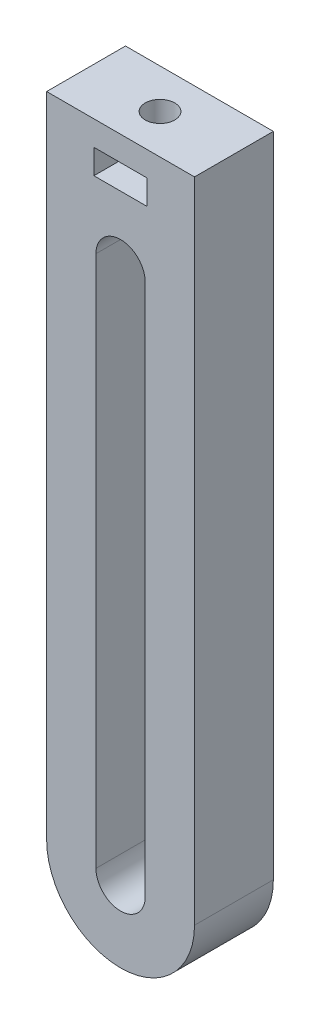
ISO-10303-21;
HEADER;
FILE_DESCRIPTION(('STEP AP214'),'2;1');
FILE_NAME('part.step','',(''),(''),'','','');
FILE_SCHEMA(('AUTOMOTIVE_DESIGN { 1 0 10303 214 1 1 1 1 }'));
ENDSEC;
DATA;
#1=APPLICATION_CONTEXT('core data for automotive mechanical design processes');
#2=APPLICATION_PROTOCOL_DEFINITION('international standard','automotive_design',2000,#1);
#3=PRODUCT_CONTEXT('',#1,'mechanical');
#4=PRODUCT('Part','Part','',(#3));
#5=PRODUCT_RELATED_PRODUCT_CATEGORY('part','',(#4));
#6=PRODUCT_DEFINITION_FORMATION('','',#4);
#7=PRODUCT_DEFINITION_CONTEXT('part definition',#1,'design');
#8=PRODUCT_DEFINITION('design','',#6,#7);
#9=PRODUCT_DEFINITION_SHAPE('','',#8);
#10=(LENGTH_UNIT() NAMED_UNIT(*) SI_UNIT(.MILLI.,.METRE.));
#11=(NAMED_UNIT(*) PLANE_ANGLE_UNIT() SI_UNIT($,.RADIAN.));
#12=(NAMED_UNIT(*) SI_UNIT($,.STERADIAN.) SOLID_ANGLE_UNIT());
#13=UNCERTAINTY_MEASURE_WITH_UNIT(LENGTH_MEASURE(1.E-05),#10,'distance_accuracy_value','');
#14=(GEOMETRIC_REPRESENTATION_CONTEXT(3) GLOBAL_UNCERTAINTY_ASSIGNED_CONTEXT((#13)) GLOBAL_UNIT_ASSIGNED_CONTEXT((#10,
#11,#12)) REPRESENTATION_CONTEXT('',''));
#15=CARTESIAN_POINT('',(0.,0.,0.));
#16=DIRECTION('',(0.,0.,1.));
#17=DIRECTION('',(1.,0.,0.));
#18=AXIS2_PLACEMENT_3D('',#15,#16,#17);
#19=CARTESIAN_POINT('',(0.,-27.,8.));
#20=DIRECTION('',(0.,0.,-1.));
#21=DIRECTION('',(-1.,0.,0.));
#22=AXIS2_PLACEMENT_3D('',#19,#20,#21);
#23=PLANE('',#22);
#24=DIRECTION('',(-1.,0.,0.));
#25=VECTOR('',#24,1.);
#26=CARTESIAN_POINT('',(-2.70500000000001,36.25,8.));
#27=LINE('',#26,#25);
#28=CARTESIAN_POINT('',(2.70499999999999,36.25,8.));
#29=VERTEX_POINT('',#28);
#30=CARTESIAN_POINT('',(-2.70500000000001,36.25,8.));
#31=VERTEX_POINT('',#30);
#32=EDGE_CURVE('E142',#29,#31,#27,.T.);
#33=ORIENTED_EDGE('',*,*,#32,.F.);
#34=DIRECTION('',(0.,1.,0.));
#35=VECTOR('',#34,1.);
#36=CARTESIAN_POINT('',(2.70499999999999,36.25,8.));
#37=LINE('',#36,#35);
#38=CARTESIAN_POINT('',(2.70499999999999,33.75,8.));
#39=VERTEX_POINT('',#38);
#40=EDGE_CURVE('E146',#39,#29,#37,.T.);
#41=ORIENTED_EDGE('',*,*,#40,.F.);
#42=DIRECTION('',(1.,0.,0.));
#43=VECTOR('',#42,1.);
#44=CARTESIAN_POINT('',(-2.70500000000001,33.75,8.));
#45=LINE('',#44,#43);
#46=CARTESIAN_POINT('',(-2.70500000000001,33.75,8.));
#47=VERTEX_POINT('',#46);
#48=EDGE_CURVE('E150',#47,#39,#45,.T.);
#49=ORIENTED_EDGE('',*,*,#48,.F.);
#50=DIRECTION('',(0.,-1.,0.));
#51=VECTOR('',#50,1.);
#52=CARTESIAN_POINT('',(-2.70500000000001,36.25,8.));
#53=LINE('',#52,#51);
#54=EDGE_CURVE('E133',#31,#47,#53,.T.);
#55=ORIENTED_EDGE('',*,*,#54,.F.);
#56=EDGE_LOOP('',(#33,#41,#49,#55));
#57=FACE_BOUND('',#56,.T.);
#58=DIRECTION('',(0.,1.,0.));
#59=VECTOR('',#58,1.);
#60=CARTESIAN_POINT('',(7.5,-27.,8.));
#61=LINE('',#60,#59);
#62=CARTESIAN_POINT('',(7.5,-27.,8.));
#63=VERTEX_POINT('',#62);
#64=CARTESIAN_POINT('',(7.5,38.75,8.));
#65=VERTEX_POINT('',#64);
#66=EDGE_CURVE('E205',#63,#65,#61,.T.);
#67=ORIENTED_EDGE('',*,*,#66,.T.);
#68=DIRECTION('',(-1.,0.,0.));
#69=VECTOR('',#68,1.);
#70=CARTESIAN_POINT('',(-7.5,38.75,8.));
#71=LINE('',#70,#69);
#72=CARTESIAN_POINT('',(-7.5,38.75,8.));
#73=VERTEX_POINT('',#72);
#74=EDGE_CURVE('E208',#65,#73,#71,.T.);
#75=ORIENTED_EDGE('',*,*,#74,.T.);
#76=DIRECTION('',(0.,-1.,0.));
#77=VECTOR('',#76,1.);
#78=CARTESIAN_POINT('',(-7.5,38.75,8.));
#79=LINE('',#78,#77);
#80=CARTESIAN_POINT('',(-7.5,-27.,8.));
#81=VERTEX_POINT('',#80);
#82=EDGE_CURVE('E211',#73,#81,#79,.T.);
#83=ORIENTED_EDGE('',*,*,#82,.T.);
#84=CARTESIAN_POINT('',(0.,-27.,8.));
#85=DIRECTION('',(0.,0.,1.));
#86=DIRECTION('',(-1.,0.,0.));
#87=AXIS2_PLACEMENT_3D('',#84,#85,#86);
#88=CIRCLE('',#87,7.5);
#89=EDGE_CURVE('E213',#81,#63,#88,.T.);
#90=ORIENTED_EDGE('',*,*,#89,.T.);
#91=EDGE_LOOP('',(#67,#75,#83,#90));
#92=FACE_BOUND('',#91,.T.);
#93=CARTESIAN_POINT('',(0.,27.,8.));
#94=DIRECTION('',(0.,0.,1.));
#95=DIRECTION('',(1.,0.,0.));
#96=AXIS2_PLACEMENT_3D('',#93,#94,#95);
#97=CIRCLE('',#96,2.49999999999999);
#98=CARTESIAN_POINT('',(2.49999999999998,27.,8.));
#99=VERTEX_POINT('',#98);
#100=CARTESIAN_POINT('',(-2.5,27.,8.));
#101=VERTEX_POINT('',#100);
#102=EDGE_CURVE('E176',#99,#101,#97,.T.);
#103=ORIENTED_EDGE('',*,*,#102,.F.);
#104=DIRECTION('',(0.,1.,0.));
#105=VECTOR('',#104,1.);
#106=CARTESIAN_POINT('',(2.49999999999998,27.,8.));
#107=LINE('',#106,#105);
#108=CARTESIAN_POINT('',(2.5,-27.,8.));
#109=VERTEX_POINT('',#108);
#110=EDGE_CURVE('E183',#109,#99,#107,.T.);
#111=ORIENTED_EDGE('',*,*,#110,.F.);
#112=CARTESIAN_POINT('',(0.,-27.,8.));
#113=DIRECTION('',(0.,0.,1.));
#114=DIRECTION('',(1.,0.,0.));
#115=AXIS2_PLACEMENT_3D('',#112,#113,#114);
#116=CIRCLE('',#115,2.49999999999999);
#117=CARTESIAN_POINT('',(-2.49999999999998,-27.,8.));
#118=VERTEX_POINT('',#117);
#119=EDGE_CURVE('E181',#118,#109,#116,.T.);
#120=ORIENTED_EDGE('',*,*,#119,.F.);
#121=DIRECTION('',(0.,-1.,0.));
#122=VECTOR('',#121,1.);
#123=CARTESIAN_POINT('',(-2.5,27.,8.));
#124=LINE('',#123,#122);
#125=EDGE_CURVE('E178',#101,#118,#124,.T.);
#126=ORIENTED_EDGE('',*,*,#125,.F.);
#127=EDGE_LOOP('',(#103,#111,#120,#126));
#128=FACE_BOUND('',#127,.T.);
#129=ADVANCED_FACE('F32',(#57,#92,#128),#23,.F.);
#130=CARTESIAN_POINT('',(0.,-27.,0.));
#131=DIRECTION('',(0.,0.,-1.));
#132=DIRECTION('',(-1.,0.,0.));
#133=AXIS2_PLACEMENT_3D('',#130,#131,#132);
#134=PLANE('',#133);
#135=DIRECTION('',(0.,1.,0.));
#136=VECTOR('',#135,1.);
#137=CARTESIAN_POINT('',(7.5,-27.,0.));
#138=LINE('',#137,#136);
#139=CARTESIAN_POINT('',(7.5,-27.,0.));
#140=VERTEX_POINT('',#139);
#141=CARTESIAN_POINT('',(7.5,38.75,0.));
#142=VERTEX_POINT('',#141);
#143=EDGE_CURVE('E204',#140,#142,#138,.T.);
#144=ORIENTED_EDGE('',*,*,#143,.F.);
#145=CARTESIAN_POINT('',(0.,-27.,0.));
#146=DIRECTION('',(0.,0.,1.));
#147=DIRECTION('',(-1.,0.,0.));
#148=AXIS2_PLACEMENT_3D('',#145,#146,#147);
#149=CIRCLE('',#148,7.5);
#150=CARTESIAN_POINT('',(-7.5,-27.,0.));
#151=VERTEX_POINT('',#150);
#152=EDGE_CURVE('E209',#151,#140,#149,.T.);
#153=ORIENTED_EDGE('',*,*,#152,.F.);
#154=DIRECTION('',(0.,-1.,0.));
#155=VECTOR('',#154,1.);
#156=CARTESIAN_POINT('',(-7.5,38.75,0.));
#157=LINE('',#156,#155);
#158=CARTESIAN_POINT('',(-7.5,38.75,0.));
#159=VERTEX_POINT('',#158);
#160=EDGE_CURVE('E220',#159,#151,#157,.T.);
#161=ORIENTED_EDGE('',*,*,#160,.F.);
#162=DIRECTION('',(-1.,0.,0.));
#163=VECTOR('',#162,1.);
#164=CARTESIAN_POINT('',(-7.5,38.75,0.));
#165=LINE('',#164,#163);
#166=EDGE_CURVE('E218',#142,#159,#165,.T.);
#167=ORIENTED_EDGE('',*,*,#166,.F.);
#168=EDGE_LOOP('',(#144,#153,#161,#167));
#169=FACE_BOUND('',#168,.T.);
#170=DIRECTION('',(0.,1.,0.));
#171=VECTOR('',#170,1.);
#172=CARTESIAN_POINT('',(2.49999999999998,27.,0.));
#173=LINE('',#172,#171);
#174=CARTESIAN_POINT('',(2.5,-27.,0.));
#175=VERTEX_POINT('',#174);
#176=CARTESIAN_POINT('',(2.49999999999998,27.,0.));
#177=VERTEX_POINT('',#176);
#178=EDGE_CURVE('E179',#175,#177,#173,.T.);
#179=ORIENTED_EDGE('',*,*,#178,.T.);
#180=CARTESIAN_POINT('',(0.,27.,0.));
#181=DIRECTION('',(0.,0.,1.));
#182=DIRECTION('',(1.,0.,0.));
#183=AXIS2_PLACEMENT_3D('',#180,#181,#182);
#184=CIRCLE('',#183,2.49999999999999);
#185=CARTESIAN_POINT('',(-2.5,27.,0.));
#186=VERTEX_POINT('',#185);
#187=EDGE_CURVE('E171',#177,#186,#184,.T.);
#188=ORIENTED_EDGE('',*,*,#187,.T.);
#189=DIRECTION('',(0.,-1.,0.));
#190=VECTOR('',#189,1.);
#191=CARTESIAN_POINT('',(-2.5,27.,0.));
#192=LINE('',#191,#190);
#193=CARTESIAN_POINT('',(-2.49999999999998,-27.,0.));
#194=VERTEX_POINT('',#193);
#195=EDGE_CURVE('E188',#186,#194,#192,.T.);
#196=ORIENTED_EDGE('',*,*,#195,.T.);
#197=CARTESIAN_POINT('',(0.,-27.,0.));
#198=DIRECTION('',(0.,0.,1.));
#199=DIRECTION('',(1.,0.,0.));
#200=AXIS2_PLACEMENT_3D('',#197,#198,#199);
#201=CIRCLE('',#200,2.49999999999999);
#202=EDGE_CURVE('E191',#194,#175,#201,.T.);
#203=ORIENTED_EDGE('',*,*,#202,.T.);
#204=EDGE_LOOP('',(#179,#188,#196,#203));
#205=FACE_BOUND('',#204,.T.);
#206=ADVANCED_FACE('F239',(#169,#205),#134,.T.);
#207=CARTESIAN_POINT('',(7.5,-27.,8.));
#208=DIRECTION('',(-1.,0.,0.));
#209=DIRECTION('',(0.,0.,1.));
#210=AXIS2_PLACEMENT_3D('',#207,#208,#209);
#211=PLANE('',#210);
#212=ORIENTED_EDGE('',*,*,#143,.T.);
#213=DIRECTION('',(0.,0.,-1.));
#214=VECTOR('',#213,1.);
#215=CARTESIAN_POINT('',(7.5,38.75,8.));
#216=LINE('',#215,#214);
#217=EDGE_CURVE('E11',#65,#142,#216,.T.);
#218=ORIENTED_EDGE('',*,*,#217,.F.);
#219=ORIENTED_EDGE('',*,*,#66,.F.);
#220=DIRECTION('',(0.,0.,-1.));
#221=VECTOR('',#220,1.);
#222=CARTESIAN_POINT('',(7.5,-27.,8.));
#223=LINE('',#222,#221);
#224=EDGE_CURVE('E215',#63,#140,#223,.T.);
#225=ORIENTED_EDGE('',*,*,#224,.T.);
#226=EDGE_LOOP('',(#212,#218,#219,#225));
#227=FACE_BOUND('',#226,.T.);
#228=ADVANCED_FACE('F34',(#227),#211,.F.);
#229=CARTESIAN_POINT('',(-7.5,38.75,8.));
#230=DIRECTION('',(0.,-1.,0.));
#231=DIRECTION('',(0.,0.,-1.));
#232=AXIS2_PLACEMENT_3D('',#229,#230,#231);
#233=PLANE('',#232);
#234=CARTESIAN_POINT('',(0.,38.75,4.));
#235=DIRECTION('',(0.,1.,0.));
#236=DIRECTION('',(0.,0.,1.));
#237=AXIS2_PLACEMENT_3D('',#234,#235,#236);
#238=CIRCLE('',#237,1.5);
#239=CARTESIAN_POINT('',(0.,38.75,5.5));
#240=VERTEX_POINT('',#239);
#241=EDGE_CURVE('E332',#240,#240,#238,.T.);
#242=ORIENTED_EDGE('',*,*,#241,.F.);
#243=EDGE_LOOP('',(#242));
#244=FACE_BOUND('',#243,.T.);
#245=ORIENTED_EDGE('',*,*,#166,.T.);
#246=DIRECTION('',(0.,0.,-1.));
#247=VECTOR('',#246,1.);
#248=CARTESIAN_POINT('',(-7.5,38.75,8.));
#249=LINE('',#248,#247);
#250=EDGE_CURVE('E41',#73,#159,#249,.T.);
#251=ORIENTED_EDGE('',*,*,#250,.F.);
#252=ORIENTED_EDGE('',*,*,#74,.F.);
#253=ORIENTED_EDGE('',*,*,#217,.T.);
#254=EDGE_LOOP('',(#245,#251,#252,#253));
#255=FACE_BOUND('',#254,.T.);
#256=ADVANCED_FACE('F249',(#244,#255),#233,.F.);
#257=CARTESIAN_POINT('',(-7.5,38.75,8.));
#258=DIRECTION('',(1.,0.,0.));
#259=DIRECTION('',(0.,0.,-1.));
#260=AXIS2_PLACEMENT_3D('',#257,#258,#259);
#261=PLANE('',#260);
#262=ORIENTED_EDGE('',*,*,#160,.T.);
#263=DIRECTION('',(0.,0.,-1.));
#264=VECTOR('',#263,1.);
#265=CARTESIAN_POINT('',(-7.5,-27.,8.));
#266=LINE('',#265,#264);
#267=EDGE_CURVE('E225',#81,#151,#266,.T.);
#268=ORIENTED_EDGE('',*,*,#267,.F.);
#269=ORIENTED_EDGE('',*,*,#82,.F.);
#270=ORIENTED_EDGE('',*,*,#250,.T.);
#271=EDGE_LOOP('',(#262,#268,#269,#270));
#272=FACE_BOUND('',#271,.T.);
#273=ADVANCED_FACE('F233',(#272),#261,.F.);
#274=CARTESIAN_POINT('',(0.,-27.,8.));
#275=DIRECTION('',(0.,0.,-1.));
#276=DIRECTION('',(-1.,0.,0.));
#277=AXIS2_PLACEMENT_3D('',#274,#275,#276);
#278=CYLINDRICAL_SURFACE('',#277,7.5);
#279=ORIENTED_EDGE('',*,*,#152,.T.);
#280=ORIENTED_EDGE('',*,*,#224,.F.);
#281=ORIENTED_EDGE('',*,*,#89,.F.);
#282=ORIENTED_EDGE('',*,*,#267,.T.);
#283=EDGE_LOOP('',(#279,#280,#281,#282));
#284=FACE_BOUND('',#283,.T.);
#285=ADVANCED_FACE('F243',(#284),#278,.T.);
#286=CARTESIAN_POINT('',(0.,27.,8.));
#287=DIRECTION('',(0.,0.,-1.));
#288=DIRECTION('',(-1.,0.,0.));
#289=AXIS2_PLACEMENT_3D('',#286,#287,#288);
#290=CYLINDRICAL_SURFACE('',#289,2.49999999999999);
#291=CARTESIAN_POINT('',(0.,29.5,5.5));
#292=CARTESIAN_POINT('',(0.0767298334620157,29.4999962578973,5.49999590899012));
#293=CARTESIAN_POINT('',(0.153582320644178,29.4964290461501,5.49407132907374));
#294=CARTESIAN_POINT('',(0.304975509530679,29.4824990360857,5.47067568048467));
#295=CARTESIAN_POINT('',(0.379510034596047,29.4721194803272,5.45317613814577));
#296=CARTESIAN_POINT('',(0.523751827790837,29.4456155805449,5.40761363883314));
#297=CARTESIAN_POINT('',(0.593481028226566,29.4295197327294,5.37960304183684));
#298=CARTESIAN_POINT('',(0.727030318214659,29.3929536762641,5.31413966685897));
#299=CARTESIAN_POINT('',(0.790851869416383,29.3724845538025,5.27668923303125));
#300=CARTESIAN_POINT('',(0.916299278999315,29.3270536071909,5.19022517329142));
#301=CARTESIAN_POINT('',(0.977384020081415,29.3018679219598,5.14054630464861));
#302=CARTESIAN_POINT('',(1.09088270411891,29.2503043927963,5.03253279617173));
#303=CARTESIAN_POINT('',(1.14328534948112,29.2239250515357,4.97418706281268));
#304=CARTESIAN_POINT('',(1.24444996762974,29.1691106699591,4.84207648950327));
#305=CARTESIAN_POINT('',(1.29197766378809,29.1408201770365,4.76729822901871));
#306=CARTESIAN_POINT('',(1.37361437764896,29.0893830141212,4.60915342675689));
#307=CARTESIAN_POINT('',(1.4077451733516,29.0662280227394,4.52580110375243));
#308=CARTESIAN_POINT('',(1.45440601714221,29.0335462966093,4.37340354934676));
#309=CARTESIAN_POINT('',(1.47016197246826,29.0220788313759,4.30576400138968));
#310=CARTESIAN_POINT('',(1.49216172340475,29.005903082955,4.16819628416964));
#311=CARTESIAN_POINT('',(1.49841734556836,29.0011863964376,4.09827107124551));
#312=CARTESIAN_POINT('',(1.50105508796009,28.9992092246385,3.95798850578267));
#313=CARTESIAN_POINT('',(1.49741783408419,29.0019633701272,3.88763057490681));
#314=CARTESIAN_POINT('',(1.48046060478828,29.0145326144374,3.74872122457242));
#315=CARTESIAN_POINT('',(1.46713334620103,29.0243530243222,3.68017120415256));
#316=CARTESIAN_POINT('',(1.43173921881792,29.0495318694426,3.5474697578719));
#317=CARTESIAN_POINT('',(1.40978748666087,29.0648171165254,3.48327294607552));
#318=CARTESIAN_POINT('',(1.35795061770837,29.0992705135083,3.35930500907188));
#319=CARTESIAN_POINT('',(1.32806257259705,29.1184400862346,3.29953551657608));
#320=CARTESIAN_POINT('',(1.25517983184583,29.1625532726898,3.1750159028772));
#321=CARTESIAN_POINT('',(1.21080724397723,29.1879204337299,3.11122190704508));
#322=CARTESIAN_POINT('',(1.11291092784003,29.2393059976438,2.99132351633299));
#323=CARTESIAN_POINT('',(1.05937845100579,29.2653250026215,2.9352265660235));
#324=CARTESIAN_POINT('',(0.935811834382972,29.3193550495832,2.82438701817825));
#325=CARTESIAN_POINT('',(0.864517682704963,29.3471383626853,2.77092269398401));
#326=CARTESIAN_POINT('',(0.712276050459006,29.3977242843398,2.67687795280209));
#327=CARTESIAN_POINT('',(0.631333763943571,29.4205295542551,2.63629064621005));
#328=CARTESIAN_POINT('',(0.467197585268213,29.4573039206615,2.5720678172041));
#329=CARTESIAN_POINT('',(0.384467624173587,29.471739574397,2.54752464428409));
#330=CARTESIAN_POINT('',(0.215047895144646,29.4921884281355,2.51298880259462));
#331=CARTESIAN_POINT('',(0.128363005661325,29.4982117295274,2.50297868224643));
#332=CARTESIAN_POINT('',(-0.033714614377391,29.5009057037461,2.49849215232169));
#333=CARTESIAN_POINT('',(-0.109042473418713,29.4987352171428,2.50209114491483));
#334=CARTESIAN_POINT('',(-0.257829401986056,29.4877871208705,2.52042585307192));
#335=CARTESIAN_POINT('',(-0.331288509376101,29.4790096451804,2.53516134280581));
#336=CARTESIAN_POINT('',(-0.472574932157608,29.4559479244219,2.57454343281246));
#337=CARTESIAN_POINT('',(-0.540495750928479,29.4418027566255,2.59894034907347));
#338=CARTESIAN_POINT('',(-0.671265749087258,29.4091388086284,2.65667737636527));
#339=CARTESIAN_POINT('',(-0.734113924963904,29.3906191658651,2.69001925134667));
#340=CARTESIAN_POINT('',(-0.86000626282386,29.3484549623736,2.7685569792087));
#341=CARTESIAN_POINT('',(-0.922394150456833,29.3244780273988,2.81462382907839));
#342=CARTESIAN_POINT('',(-1.03902603131013,29.2747426557473,2.91539139348861));
#343=CARTESIAN_POINT('',(-1.09326040273738,29.2489821658636,2.97010215485253));
#344=CARTESIAN_POINT('',(-1.19931996735579,29.1944542390989,3.09491039003715));
#345=CARTESIAN_POINT('',(-1.24991019630914,29.1657324174629,3.1660838854655));
#346=CARTESIAN_POINT('',(-1.33845238915667,29.1121618206671,3.3172160245682));
#347=CARTESIAN_POINT('',(-1.37641766769781,29.0873089799769,3.39716529389278));
#348=CARTESIAN_POINT('',(-1.43142578795776,29.0498490924052,3.54624302230668));
#349=CARTESIAN_POINT('',(-1.4512162533619,29.0357565932873,3.61398031235858));
#350=CARTESIAN_POINT('',(-1.48113663905971,29.0140960574354,3.7525320780801));
#351=CARTESIAN_POINT('',(-1.4912799529763,29.0065189764272,3.82334214432782));
#352=CARTESIAN_POINT('',(-1.50134130416631,28.9990044661627,3.96637694759702));
#353=CARTESIAN_POINT('',(-1.50122089107869,28.9990957644594,4.03860599068704));
#354=CARTESIAN_POINT('',(-1.49066472959328,29.0069771789285,4.18189443560945));
#355=CARTESIAN_POINT('',(-1.48022337215759,29.0147714813882,4.25295318008059));
#356=CARTESIAN_POINT('',(-1.45040174148913,29.0363318524298,4.38848841757218));
#357=CARTESIAN_POINT('',(-1.43147636845351,29.0497921180558,4.45311709430686));
#358=CARTESIAN_POINT('',(-1.38563242076993,29.0810550196015,4.57833725447421));
#359=CARTESIAN_POINT('',(-1.3587108358848,29.0988592904048,4.63892720696055));
#360=CARTESIAN_POINT('',(-1.29289245555733,29.1401299055092,4.76431985722077));
#361=CARTESIAN_POINT('',(-1.25279167675753,29.1640458758264,4.8283411038543));
#362=CARTESIAN_POINT('',(-1.16375698389085,29.2132012703077,4.94938007261729));
#363=CARTESIAN_POINT('',(-1.11481579607799,29.2384417720502,5.00639196215255));
#364=CARTESIAN_POINT('',(-1.00009777425735,29.2922569029148,5.12135094913167));
#365=CARTESIAN_POINT('',(-0.932876819313909,29.3207030866366,5.17793107489618));
#366=CARTESIAN_POINT('',(-0.788462434445595,29.3736542887237,5.2790978558633));
#367=CARTESIAN_POINT('',(-0.711265444501546,29.3981578931093,5.32368021198479));
#368=CARTESIAN_POINT('',(-0.551125230801461,29.4398557865439,5.39778580757373));
#369=CARTESIAN_POINT('',(-0.468430086957222,29.4572507747979,5.42772806492683));
#370=CARTESIAN_POINT('',(-0.297973306118816,29.4836627300125,5.47272469521097));
#371=CARTESIAN_POINT('',(-0.210232099648621,29.4927112587148,5.48783516785699));
#372=CARTESIAN_POINT('',(-0.101558096917542,29.4980200116819,5.49669745470866));
#373=CARTESIAN_POINT('',(-0.0812762590282824,29.4987611465636,5.4979344173061));
#374=CARTESIAN_POINT('',(-0.0406658206871148,29.4997516451737,5.49958624637086));
#375=CARTESIAN_POINT('',(-0.0203372186375707,29.5000009918432,5.5000010843209));
#376=CARTESIAN_POINT('',(0.,29.5,5.5));
#377=B_SPLINE_CURVE_WITH_KNOTS('',3,(#291,#292,#293,#294,#295,#296,#297,#298,#299,#300,#301,
#302,#303,#304,#305,#306,#307,#308,#309,#310,#311,#312,#313,#314,#315,#316,#317,#318,#319,#320,
#321,#322,#323,#324,#325,#326,#327,#328,#329,#330,#331,#332,#333,#334,#335,#336,#337,#338,#339,
#340,#341,#342,#343,#344,#345,#346,#347,#348,#349,#350,#351,#352,#353,#354,#355,#356,#357,#358,
#359,#360,#361,#362,#363,#364,#365,#366,#367,#368,#369,#370,#371,#372,#373,#374,#375,#376),
.UNSPECIFIED.,.T.,.F.,(4,2,2,2,2,2,2,2,2,2,2,2,2,2,2,2,2,2,2,2,2,2,2,2,2,2,2,2,2,2,2,2,2,2,2,2,
2,2,2,2,2,2,4),(0.,0.230102237548649,0.460772627520012,0.690308884600012,0.919788197992276,
1.16681590732473,1.41416257934801,1.69183813189808,1.96906040692092,2.17933829855634,
2.38935420916578,2.59978170870726,2.81036753273872,3.01823267593207,3.22617409809868,
3.47046995225162,3.71500044803674,3.99360957884691,4.27206939275324,4.53296790696559,
4.79355286918236,5.01875602722426,5.24395461863455,5.46367785689771,5.68344445659025,
5.92601365818362,6.16886690081836,6.44336762428009,6.71757792616455,6.93257787314692,
7.14727888733318,7.36278425777432,7.57840681155724,7.78364098331141,7.98895251523034,
8.22578610052285,8.46281544370207,8.73854311775518,9.01436946031984,9.28175654462676,
9.54812832184447,9.60911473335177,9.6701032602764),.UNSPECIFIED.);
#378=CARTESIAN_POINT('',(0.,29.5,5.5));
#379=VERTEX_POINT('',#378);
#380=EDGE_CURVE('E282',#379,#379,#377,.T.);
#381=ORIENTED_EDGE('',*,*,#380,.T.);
#382=EDGE_LOOP('',(#381));
#383=FACE_BOUND('',#382,.T.);
#384=ORIENTED_EDGE('',*,*,#187,.F.);
#385=DIRECTION('',(0.,0.,-1.));
#386=VECTOR('',#385,1.);
#387=CARTESIAN_POINT('',(2.49999999999998,27.,8.));
#388=LINE('',#387,#386);
#389=EDGE_CURVE('E185',#99,#177,#388,.T.);
#390=ORIENTED_EDGE('',*,*,#389,.F.);
#391=ORIENTED_EDGE('',*,*,#102,.T.);
#392=DIRECTION('',(0.,0.,-1.));
#393=VECTOR('',#392,1.);
#394=CARTESIAN_POINT('',(-2.5,27.,8.));
#395=LINE('',#394,#393);
#396=EDGE_CURVE('E201',#101,#186,#395,.T.);
#397=ORIENTED_EDGE('',*,*,#396,.T.);
#398=EDGE_LOOP('',(#384,#390,#391,#397));
#399=FACE_BOUND('',#398,.T.);
#400=ADVANCED_FACE('F265',(#383,#399),#290,.F.);
#401=CARTESIAN_POINT('',(-2.5,27.,8.));
#402=DIRECTION('',(1.,0.,0.));
#403=DIRECTION('',(0.,1.,0.));
#404=AXIS2_PLACEMENT_3D('',#401,#402,#403);
#405=PLANE('',#404);
#406=ORIENTED_EDGE('',*,*,#195,.F.);
#407=ORIENTED_EDGE('',*,*,#396,.F.);
#408=ORIENTED_EDGE('',*,*,#125,.T.);
#409=DIRECTION('',(0.,0.,-1.));
#410=VECTOR('',#409,1.);
#411=CARTESIAN_POINT('',(-2.49999999999998,-27.,8.));
#412=LINE('',#411,#410);
#413=EDGE_CURVE('E199',#118,#194,#412,.T.);
#414=ORIENTED_EDGE('',*,*,#413,.T.);
#415=EDGE_LOOP('',(#406,#407,#408,#414));
#416=FACE_BOUND('',#415,.T.);
#417=ADVANCED_FACE('F272',(#416),#405,.T.);
#418=CARTESIAN_POINT('',(0.,-27.,8.));
#419=DIRECTION('',(0.,0.,-1.));
#420=DIRECTION('',(-1.,0.,0.));
#421=AXIS2_PLACEMENT_3D('',#418,#419,#420);
#422=CYLINDRICAL_SURFACE('',#421,2.49999999999999);
#423=ORIENTED_EDGE('',*,*,#202,.F.);
#424=ORIENTED_EDGE('',*,*,#413,.F.);
#425=ORIENTED_EDGE('',*,*,#119,.T.);
#426=DIRECTION('',(0.,0.,-1.));
#427=VECTOR('',#426,1.);
#428=CARTESIAN_POINT('',(2.5,-27.,8.));
#429=LINE('',#428,#427);
#430=EDGE_CURVE('E56',#109,#175,#429,.T.);
#431=ORIENTED_EDGE('',*,*,#430,.T.);
#432=EDGE_LOOP('',(#423,#424,#425,#431));
#433=FACE_BOUND('',#432,.T.);
#434=ADVANCED_FACE('F277',(#433),#422,.F.);
#435=CARTESIAN_POINT('',(2.49999999999998,27.,8.));
#436=DIRECTION('',(-1.,0.,0.));
#437=DIRECTION('',(0.,-1.,0.));
#438=AXIS2_PLACEMENT_3D('',#435,#436,#437);
#439=PLANE('',#438);
#440=ORIENTED_EDGE('',*,*,#178,.F.);
#441=ORIENTED_EDGE('',*,*,#430,.F.);
#442=ORIENTED_EDGE('',*,*,#110,.T.);
#443=ORIENTED_EDGE('',*,*,#389,.T.);
#444=EDGE_LOOP('',(#440,#441,#442,#443));
#445=FACE_BOUND('',#444,.T.);
#446=ADVANCED_FACE('F286',(#445),#439,.T.);
#447=CARTESIAN_POINT('',(-2.705,33.75,2.43826752184206));
#448=DIRECTION('',(-1.,0.,0.));
#449=DIRECTION('',(0.,0.,1.));
#450=AXIS2_PLACEMENT_3D('',#447,#448,#449);
#451=PLANE('',#450);
#452=ORIENTED_EDGE('',*,*,#54,.T.);
#453=DIRECTION('',(0.,0.,1.));
#454=VECTOR('',#453,1.);
#455=CARTESIAN_POINT('',(-2.705,33.75,2.43826752184206));
#456=LINE('',#455,#454);
#457=CARTESIAN_POINT('',(-2.705,33.75,2.43826752184206));
#458=VERTEX_POINT('',#457);
#459=EDGE_CURVE('E162',#458,#47,#456,.T.);
#460=ORIENTED_EDGE('',*,*,#459,.F.);
#461=DIRECTION('',(0.,1.,0.));
#462=VECTOR('',#461,1.);
#463=CARTESIAN_POINT('',(-2.705,33.75,2.43826752184206));
#464=LINE('',#463,#462);
#465=CARTESIAN_POINT('',(-2.705,36.25,2.43826752184206));
#466=VERTEX_POINT('',#465);
#467=EDGE_CURVE('E135',#458,#466,#464,.T.);
#468=ORIENTED_EDGE('',*,*,#467,.T.);
#469=DIRECTION('',(0.,0.,1.));
#470=VECTOR('',#469,1.);
#471=CARTESIAN_POINT('',(-2.705,36.25,2.43826752184206));
#472=LINE('',#471,#470);
#473=EDGE_CURVE('E129',#466,#31,#472,.T.);
#474=ORIENTED_EDGE('',*,*,#473,.T.);
#475=EDGE_LOOP('',(#452,#460,#468,#474));
#476=FACE_BOUND('',#475,.T.);
#477=ADVANCED_FACE('F130',(#476),#451,.F.);
#478=CARTESIAN_POINT('',(0.,33.75,0.876535043684125));
#479=DIRECTION('',(-0.5,0.,-0.866025403784439));
#480=DIRECTION('',(-0.866025403784439,0.,0.5));
#481=AXIS2_PLACEMENT_3D('',#478,#479,#480);
#482=PLANE('',#481);
#483=DIRECTION('',(-0.866025403784439,0.,0.5));
#484=VECTOR('',#483,1.);
#485=CARTESIAN_POINT('',(0.,36.25,0.876535043684125));
#486=LINE('',#485,#484);
#487=CARTESIAN_POINT('',(0.,36.25,0.876535043684125));
#488=VERTEX_POINT('',#487);
#489=EDGE_CURVE('E139',#488,#466,#486,.T.);
#490=ORIENTED_EDGE('',*,*,#489,.T.);
#491=ORIENTED_EDGE('',*,*,#467,.F.);
#492=DIRECTION('',(-0.866025403784439,0.,0.5));
#493=VECTOR('',#492,1.);
#494=CARTESIAN_POINT('',(0.,33.75,0.876535043684125));
#495=LINE('',#494,#493);
#496=CARTESIAN_POINT('',(0.,33.75,0.876535043684125));
#497=VERTEX_POINT('',#496);
#498=EDGE_CURVE('E159',#497,#458,#495,.T.);
#499=ORIENTED_EDGE('',*,*,#498,.F.);
#500=DIRECTION('',(0.,1.,0.));
#501=VECTOR('',#500,1.);
#502=CARTESIAN_POINT('',(0.,33.75,0.876535043684125));
#503=LINE('',#502,#501);
#504=EDGE_CURVE('E172',#497,#488,#503,.T.);
#505=ORIENTED_EDGE('',*,*,#504,.T.);
#506=EDGE_LOOP('',(#490,#491,#499,#505));
#507=FACE_BOUND('',#506,.T.);
#508=ADVANCED_FACE('F308',(#507),#482,.F.);
#509=CARTESIAN_POINT('',(2.705,33.75,2.43826752184206));
#510=DIRECTION('',(0.5,0.,-0.866025403784439));
#511=DIRECTION('',(-0.866025403784439,0.,-0.5));
#512=AXIS2_PLACEMENT_3D('',#509,#510,#511);
#513=PLANE('',#512);
#514=DIRECTION('',(-0.866025403784438,0.,-0.5));
#515=VECTOR('',#514,1.);
#516=CARTESIAN_POINT('',(2.705,36.25,2.43826752184206));
#517=LINE('',#516,#515);
#518=CARTESIAN_POINT('',(2.705,36.25,2.43826752184206));
#519=VERTEX_POINT('',#518);
#520=EDGE_CURVE('E166',#519,#488,#517,.T.);
#521=ORIENTED_EDGE('',*,*,#520,.T.);
#522=ORIENTED_EDGE('',*,*,#504,.F.);
#523=DIRECTION('',(-0.866025403784438,0.,-0.5));
#524=VECTOR('',#523,1.);
#525=CARTESIAN_POINT('',(2.705,33.75,2.43826752184206));
#526=LINE('',#525,#524);
#527=CARTESIAN_POINT('',(2.705,33.75,2.43826752184206));
#528=VERTEX_POINT('',#527);
#529=EDGE_CURVE('E156',#528,#497,#526,.T.);
#530=ORIENTED_EDGE('',*,*,#529,.F.);
#531=DIRECTION('',(0.,1.,0.));
#532=VECTOR('',#531,1.);
#533=CARTESIAN_POINT('',(2.705,33.75,2.43826752184206));
#534=LINE('',#533,#532);
#535=EDGE_CURVE('E164',#528,#519,#534,.T.);
#536=ORIENTED_EDGE('',*,*,#535,.T.);
#537=EDGE_LOOP('',(#521,#522,#530,#536));
#538=FACE_BOUND('',#537,.T.);
#539=ADVANCED_FACE('F304',(#538),#513,.F.);
#540=CARTESIAN_POINT('',(2.705,33.75,5.56173247815794));
#541=DIRECTION('',(1.,0.,0.));
#542=DIRECTION('',(0.,0.,-1.));
#543=AXIS2_PLACEMENT_3D('',#540,#541,#542);
#544=PLANE('',#543);
#545=DIRECTION('',(0.,0.,-1.));
#546=VECTOR('',#545,1.);
#547=CARTESIAN_POINT('',(2.705,36.25,5.56173247815794));
#548=LINE('',#547,#546);
#549=EDGE_CURVE('E48',#29,#519,#548,.T.);
#550=ORIENTED_EDGE('',*,*,#549,.T.);
#551=ORIENTED_EDGE('',*,*,#535,.F.);
#552=DIRECTION('',(0.,0.,-1.));
#553=VECTOR('',#552,1.);
#554=CARTESIAN_POINT('',(2.705,33.75,5.56173247815794));
#555=LINE('',#554,#553);
#556=EDGE_CURVE('E138',#39,#528,#555,.T.);
#557=ORIENTED_EDGE('',*,*,#556,.F.);
#558=ORIENTED_EDGE('',*,*,#40,.T.);
#559=EDGE_LOOP('',(#550,#551,#557,#558));
#560=FACE_BOUND('',#559,.T.);
#561=ADVANCED_FACE('F300',(#560),#544,.F.);
#562=CARTESIAN_POINT('',(0.,33.75,0.));
#563=DIRECTION('',(0.,1.,0.));
#564=DIRECTION('',(0.,0.,1.));
#565=AXIS2_PLACEMENT_3D('',#562,#563,#564);
#566=PLANE('',#565);
#567=CARTESIAN_POINT('',(0.,33.75,4.));
#568=DIRECTION('',(0.,1.,0.));
#569=DIRECTION('',(0.,0.,1.));
#570=AXIS2_PLACEMENT_3D('',#567,#568,#569);
#571=CIRCLE('',#570,1.5);
#572=CARTESIAN_POINT('',(0.,33.75,5.5));
#573=VERTEX_POINT('',#572);
#574=EDGE_CURVE('E333',#573,#573,#571,.T.);
#575=ORIENTED_EDGE('',*,*,#574,.F.);
#576=EDGE_LOOP('',(#575));
#577=FACE_BOUND('',#576,.T.);
#578=ORIENTED_EDGE('',*,*,#556,.T.);
#579=ORIENTED_EDGE('',*,*,#529,.T.);
#580=ORIENTED_EDGE('',*,*,#498,.T.);
#581=ORIENTED_EDGE('',*,*,#459,.T.);
#582=ORIENTED_EDGE('',*,*,#48,.T.);
#583=EDGE_LOOP('',(#578,#579,#580,#581,#582));
#584=FACE_BOUND('',#583,.T.);
#585=ADVANCED_FACE('F303',(#577,#584),#566,.T.);
#586=CARTESIAN_POINT('',(0.,36.25,0.));
#587=DIRECTION('',(0.,1.,0.));
#588=DIRECTION('',(0.,0.,1.));
#589=AXIS2_PLACEMENT_3D('',#586,#587,#588);
#590=PLANE('',#589);
#591=CARTESIAN_POINT('',(0.,36.25,4.));
#592=DIRECTION('',(0.,1.,0.));
#593=DIRECTION('',(0.,0.,1.));
#594=AXIS2_PLACEMENT_3D('',#591,#592,#593);
#595=CIRCLE('',#594,1.5);
#596=CARTESIAN_POINT('',(0.,36.25,5.5));
#597=VERTEX_POINT('',#596);
#598=EDGE_CURVE('E36',#597,#597,#595,.T.);
#599=ORIENTED_EDGE('',*,*,#598,.T.);
#600=EDGE_LOOP('',(#599));
#601=FACE_BOUND('',#600,.T.);
#602=ORIENTED_EDGE('',*,*,#32,.T.);
#603=ORIENTED_EDGE('',*,*,#473,.F.);
#604=ORIENTED_EDGE('',*,*,#489,.F.);
#605=ORIENTED_EDGE('',*,*,#520,.F.);
#606=ORIENTED_EDGE('',*,*,#549,.F.);
#607=EDGE_LOOP('',(#602,#603,#604,#605,#606));
#608=FACE_BOUND('',#607,.T.);
#609=ADVANCED_FACE('F143',(#601,#608),#590,.F.);
#610=CARTESIAN_POINT('',(0.,-34.501,4.));
#611=DIRECTION('',(0.,1.,0.));
#612=DIRECTION('',(0.,0.,1.));
#613=AXIS2_PLACEMENT_3D('',#610,#611,#612);
#614=CYLINDRICAL_SURFACE('',#613,1.5);
#615=ORIENTED_EDGE('',*,*,#241,.T.);
#616=EDGE_LOOP('',(#615));
#617=FACE_BOUND('',#616,.T.);
#618=ORIENTED_EDGE('',*,*,#598,.F.);
#619=EDGE_LOOP('',(#618));
#620=FACE_BOUND('',#619,.T.);
#621=ADVANCED_FACE('F317',(#617,#620),#614,.F.);
#622=ORIENTED_EDGE('',*,*,#574,.T.);
#623=EDGE_LOOP('',(#622));
#624=FACE_BOUND('',#623,.T.);
#625=ORIENTED_EDGE('',*,*,#380,.F.);
#626=EDGE_LOOP('',(#625));
#627=FACE_BOUND('',#626,.T.);
#628=ADVANCED_FACE('F324',(#624,#627),#614,.F.);
#629=CLOSED_SHELL('',(#129,#206,#228,#256,#273,#285,#400,#417,#434,#446,#477,#508,#539,#561,
#585,#609,#621,#628));
#630=MANIFOLD_SOLID_BREP('B2',#629);
#631=ADVANCED_BREP_SHAPE_REPRESENTATION('',(#18,#630),#14);
#632=SHAPE_DEFINITION_REPRESENTATION(#9,#631);
ENDSEC;
END-ISO-10303-21;
